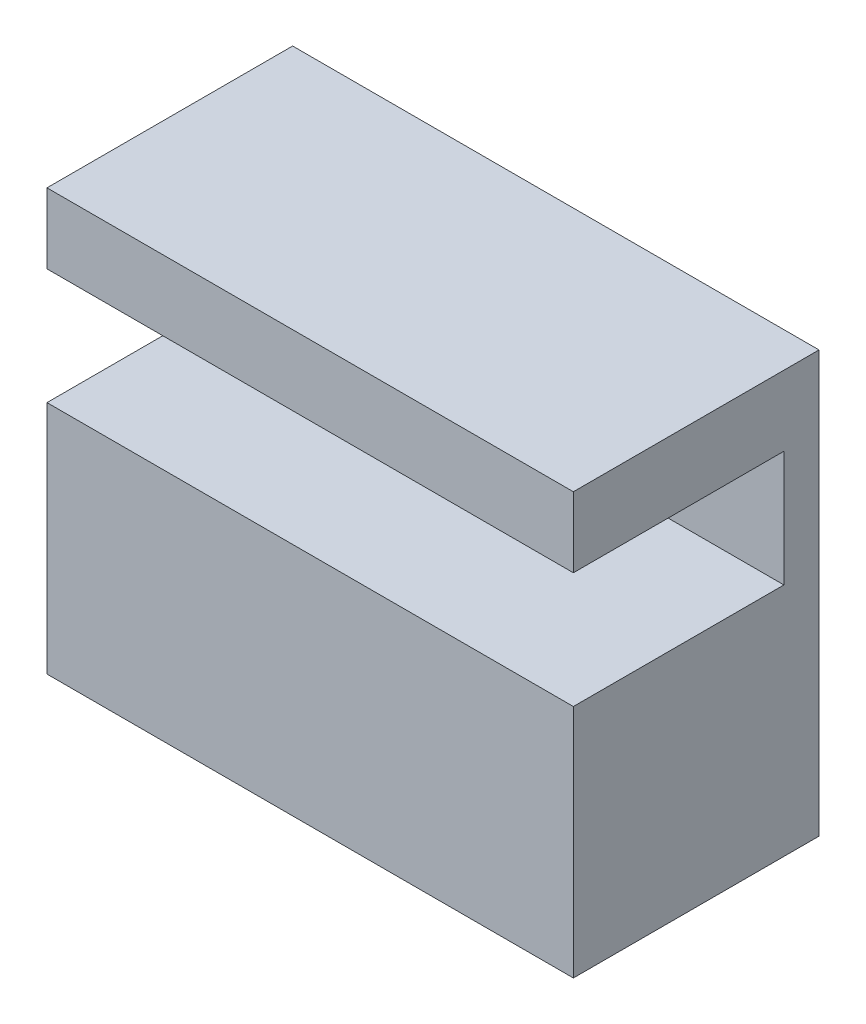
ISO-10303-21;
HEADER;
FILE_DESCRIPTION(('STEP AP214'),'2;1');
FILE_NAME('part.step','',(''),(''),'','','');
FILE_SCHEMA(('AUTOMOTIVE_DESIGN { 1 0 10303 214 1 1 1 1 }'));
ENDSEC;
DATA;
#1=APPLICATION_CONTEXT('core data for automotive mechanical design processes');
#2=APPLICATION_PROTOCOL_DEFINITION('international standard','automotive_design',2000,#1);
#3=PRODUCT_CONTEXT('',#1,'mechanical');
#4=PRODUCT('Part','Part','',(#3));
#5=PRODUCT_RELATED_PRODUCT_CATEGORY('part','',(#4));
#6=PRODUCT_DEFINITION_FORMATION('','',#4);
#7=PRODUCT_DEFINITION_CONTEXT('part definition',#1,'design');
#8=PRODUCT_DEFINITION('design','',#6,#7);
#9=PRODUCT_DEFINITION_SHAPE('','',#8);
#10=(LENGTH_UNIT() NAMED_UNIT(*) SI_UNIT(.MILLI.,.METRE.));
#11=(NAMED_UNIT(*) PLANE_ANGLE_UNIT() SI_UNIT($,.RADIAN.));
#12=(NAMED_UNIT(*) SI_UNIT($,.STERADIAN.) SOLID_ANGLE_UNIT());
#13=UNCERTAINTY_MEASURE_WITH_UNIT(LENGTH_MEASURE(1.E-05),#10,'distance_accuracy_value','');
#14=(GEOMETRIC_REPRESENTATION_CONTEXT(3) GLOBAL_UNCERTAINTY_ASSIGNED_CONTEXT((#13)) GLOBAL_UNIT_ASSIGNED_CONTEXT((#10,
#11,#12)) REPRESENTATION_CONTEXT('',''));
#15=CARTESIAN_POINT('',(0.,0.,0.));
#16=DIRECTION('',(0.,0.,1.));
#17=DIRECTION('',(1.,0.,0.));
#18=AXIS2_PLACEMENT_3D('',#15,#16,#17);
#19=CARTESIAN_POINT('',(7.5,6.,7.));
#20=DIRECTION('',(-1.,0.,0.));
#21=DIRECTION('',(0.,-1.,0.));
#22=AXIS2_PLACEMENT_3D('',#19,#20,#21);
#23=PLANE('',#22);
#24=DIRECTION('',(0.,0.,1.));
#25=VECTOR('',#24,1.);
#26=CARTESIAN_POINT('',(7.5,4.,1.));
#27=LINE('',#26,#25);
#28=CARTESIAN_POINT('',(7.5,4.,1.));
#29=VERTEX_POINT('',#28);
#30=CARTESIAN_POINT('',(7.5,4.,7.));
#31=VERTEX_POINT('',#30);
#32=EDGE_CURVE('E137',#29,#31,#27,.T.);
#33=ORIENTED_EDGE('',*,*,#32,.F.);
#34=DIRECTION('',(0.,1.,0.));
#35=VECTOR('',#34,1.);
#36=CARTESIAN_POINT('',(7.5,0.,1.));
#37=LINE('',#36,#35);
#38=CARTESIAN_POINT('',(7.5,0.699999999999999,1.));
#39=VERTEX_POINT('',#38);
#40=EDGE_CURVE('E117',#39,#29,#37,.T.);
#41=ORIENTED_EDGE('',*,*,#40,.F.);
#42=DIRECTION('',(0.,0.,1.));
#43=VECTOR('',#42,1.);
#44=CARTESIAN_POINT('',(7.5,0.699999999999999,1.));
#45=LINE('',#44,#43);
#46=CARTESIAN_POINT('',(7.5,0.699999999999999,7.));
#47=VERTEX_POINT('',#46);
#48=EDGE_CURVE('E140',#39,#47,#45,.T.);
#49=ORIENTED_EDGE('',*,*,#48,.T.);
#50=DIRECTION('',(0.,1.,0.));
#51=VECTOR('',#50,1.);
#52=CARTESIAN_POINT('',(7.5,6.,7.));
#53=LINE('',#52,#51);
#54=CARTESIAN_POINT('',(7.5,-6.,7.));
#55=VERTEX_POINT('',#54);
#56=EDGE_CURVE('E144',#55,#47,#53,.T.);
#57=ORIENTED_EDGE('',*,*,#56,.F.);
#58=DIRECTION('',(0.,0.,-1.));
#59=VECTOR('',#58,1.);
#60=CARTESIAN_POINT('',(7.5,-6.,7.));
#61=LINE('',#60,#59);
#62=CARTESIAN_POINT('',(7.5,-6.,0.));
#63=VERTEX_POINT('',#62);
#64=EDGE_CURVE('E152',#55,#63,#61,.T.);
#65=ORIENTED_EDGE('',*,*,#64,.T.);
#66=DIRECTION('',(0.,1.,0.));
#67=VECTOR('',#66,1.);
#68=CARTESIAN_POINT('',(7.5,6.,0.));
#69=LINE('',#68,#67);
#70=CARTESIAN_POINT('',(7.5,6.,0.));
#71=VERTEX_POINT('',#70);
#72=EDGE_CURVE('E139',#63,#71,#69,.T.);
#73=ORIENTED_EDGE('',*,*,#72,.T.);
#74=DIRECTION('',(0.,0.,-1.));
#75=VECTOR('',#74,1.);
#76=CARTESIAN_POINT('',(7.5,6.,7.));
#77=LINE('',#76,#75);
#78=CARTESIAN_POINT('',(7.5,6.,7.));
#79=VERTEX_POINT('',#78);
#80=EDGE_CURVE('E11',#79,#71,#77,.T.);
#81=ORIENTED_EDGE('',*,*,#80,.F.);
#82=EDGE_CURVE('E85',#31,#79,#53,.T.);
#83=ORIENTED_EDGE('',*,*,#82,.F.);
#84=EDGE_LOOP('',(#33,#41,#49,#57,#65,#73,#81,#83));
#85=FACE_BOUND('',#84,.T.);
#86=ADVANCED_FACE('F33',(#85),#23,.F.);
#87=CARTESIAN_POINT('',(-7.5,6.,7.));
#88=DIRECTION('',(1.,0.,0.));
#89=DIRECTION('',(0.,1.,0.));
#90=AXIS2_PLACEMENT_3D('',#87,#88,#89);
#91=PLANE('',#90);
#92=DIRECTION('',(0.,0.,1.));
#93=VECTOR('',#92,1.);
#94=CARTESIAN_POINT('',(-7.5,4.,1.));
#95=LINE('',#94,#93);
#96=CARTESIAN_POINT('',(-7.5,4.,1.));
#97=VERTEX_POINT('',#96);
#98=CARTESIAN_POINT('',(-7.5,4.,7.));
#99=VERTEX_POINT('',#98);
#100=EDGE_CURVE('E107',#97,#99,#95,.T.);
#101=ORIENTED_EDGE('',*,*,#100,.T.);
#102=DIRECTION('',(0.,-1.,0.));
#103=VECTOR('',#102,1.);
#104=CARTESIAN_POINT('',(-7.5,6.,7.));
#105=LINE('',#104,#103);
#106=CARTESIAN_POINT('',(-7.5,6.,7.));
#107=VERTEX_POINT('',#106);
#108=EDGE_CURVE('E149',#107,#99,#105,.T.);
#109=ORIENTED_EDGE('',*,*,#108,.F.);
#110=DIRECTION('',(0.,0.,-1.));
#111=VECTOR('',#110,1.);
#112=CARTESIAN_POINT('',(-7.5,6.,7.));
#113=LINE('',#112,#111);
#114=CARTESIAN_POINT('',(-7.5,6.,0.));
#115=VERTEX_POINT('',#114);
#116=EDGE_CURVE('E40',#107,#115,#113,.T.);
#117=ORIENTED_EDGE('',*,*,#116,.T.);
#118=DIRECTION('',(0.,-1.,0.));
#119=VECTOR('',#118,1.);
#120=CARTESIAN_POINT('',(-7.5,6.,0.));
#121=LINE('',#120,#119);
#122=CARTESIAN_POINT('',(-7.5,-6.,0.));
#123=VERTEX_POINT('',#122);
#124=EDGE_CURVE('E157',#115,#123,#121,.T.);
#125=ORIENTED_EDGE('',*,*,#124,.T.);
#126=DIRECTION('',(0.,0.,-1.));
#127=VECTOR('',#126,1.);
#128=CARTESIAN_POINT('',(-7.5,-6.,7.));
#129=LINE('',#128,#127);
#130=CARTESIAN_POINT('',(-7.5,-6.,7.));
#131=VERTEX_POINT('',#130);
#132=EDGE_CURVE('E161',#131,#123,#129,.T.);
#133=ORIENTED_EDGE('',*,*,#132,.F.);
#134=CARTESIAN_POINT('',(-7.5,0.699999999999999,7.));
#135=VERTEX_POINT('',#134);
#136=EDGE_CURVE('E148',#135,#131,#105,.T.);
#137=ORIENTED_EDGE('',*,*,#136,.F.);
#138=DIRECTION('',(0.,0.,1.));
#139=VECTOR('',#138,1.);
#140=CARTESIAN_POINT('',(-7.5,0.699999999999999,1.));
#141=LINE('',#140,#139);
#142=CARTESIAN_POINT('',(-7.5,0.699999999999999,1.));
#143=VERTEX_POINT('',#142);
#144=EDGE_CURVE('E47',#143,#135,#141,.T.);
#145=ORIENTED_EDGE('',*,*,#144,.F.);
#146=DIRECTION('',(0.,-1.,0.));
#147=VECTOR('',#146,1.);
#148=CARTESIAN_POINT('',(-7.5,0.,1.));
#149=LINE('',#148,#147);
#150=EDGE_CURVE('E123',#97,#143,#149,.T.);
#151=ORIENTED_EDGE('',*,*,#150,.F.);
#152=EDGE_LOOP('',(#101,#109,#117,#125,#133,#137,#145,#151));
#153=FACE_BOUND('',#152,.T.);
#154=ADVANCED_FACE('F128',(#153),#91,.F.);
#155=CARTESIAN_POINT('',(0.,0.,7.));
#156=DIRECTION('',(0.,0.,1.));
#157=DIRECTION('',(1.,0.,0.));
#158=AXIS2_PLACEMENT_3D('',#155,#156,#157);
#159=PLANE('',#158);
#160=ORIENTED_EDGE('',*,*,#108,.T.);
#161=DIRECTION('',(1.,0.,0.));
#162=VECTOR('',#161,1.);
#163=CARTESIAN_POINT('',(0.,4.,7.));
#164=LINE('',#163,#162);
#165=EDGE_CURVE('E112',#99,#31,#164,.T.);
#166=ORIENTED_EDGE('',*,*,#165,.T.);
#167=ORIENTED_EDGE('',*,*,#82,.T.);
#168=DIRECTION('',(-1.,0.,0.));
#169=VECTOR('',#168,1.);
#170=CARTESIAN_POINT('',(-7.5,6.,7.));
#171=LINE('',#170,#169);
#172=EDGE_CURVE('E146',#79,#107,#171,.T.);
#173=ORIENTED_EDGE('',*,*,#172,.T.);
#174=EDGE_LOOP('',(#160,#166,#167,#173));
#175=FACE_BOUND('',#174,.T.);
#176=ADVANCED_FACE('F176',(#175),#159,.T.);
#177=CARTESIAN_POINT('',(-7.5,6.,7.));
#178=DIRECTION('',(0.,-1.,0.));
#179=DIRECTION('',(0.,0.,-1.));
#180=AXIS2_PLACEMENT_3D('',#177,#178,#179);
#181=PLANE('',#180);
#182=DIRECTION('',(-1.,0.,0.));
#183=VECTOR('',#182,1.);
#184=CARTESIAN_POINT('',(-7.5,6.,0.));
#185=LINE('',#184,#183);
#186=EDGE_CURVE('E155',#71,#115,#185,.T.);
#187=ORIENTED_EDGE('',*,*,#186,.T.);
#188=ORIENTED_EDGE('',*,*,#116,.F.);
#189=ORIENTED_EDGE('',*,*,#172,.F.);
#190=ORIENTED_EDGE('',*,*,#80,.T.);
#191=EDGE_LOOP('',(#187,#188,#189,#190));
#192=FACE_BOUND('',#191,.T.);
#193=ADVANCED_FACE('F177',(#192),#181,.F.);
#194=CARTESIAN_POINT('',(-7.5,-6.,7.));
#195=DIRECTION('',(0.,1.,0.));
#196=DIRECTION('',(0.,0.,1.));
#197=AXIS2_PLACEMENT_3D('',#194,#195,#196);
#198=PLANE('',#197);
#199=DIRECTION('',(1.,0.,0.));
#200=VECTOR('',#199,1.);
#201=CARTESIAN_POINT('',(-7.5,-6.,0.));
#202=LINE('',#201,#200);
#203=EDGE_CURVE('E77',#123,#63,#202,.T.);
#204=ORIENTED_EDGE('',*,*,#203,.T.);
#205=ORIENTED_EDGE('',*,*,#64,.F.);
#206=DIRECTION('',(1.,0.,0.));
#207=VECTOR('',#206,1.);
#208=CARTESIAN_POINT('',(-7.5,-6.,7.));
#209=LINE('',#208,#207);
#210=EDGE_CURVE('E56',#131,#55,#209,.T.);
#211=ORIENTED_EDGE('',*,*,#210,.F.);
#212=ORIENTED_EDGE('',*,*,#132,.T.);
#213=EDGE_LOOP('',(#204,#205,#211,#212));
#214=FACE_BOUND('',#213,.T.);
#215=ADVANCED_FACE('F173',(#214),#198,.F.);
#216=DIRECTION('',(1.,0.,0.));
#217=VECTOR('',#216,1.);
#218=CARTESIAN_POINT('',(0.,0.699999999999999,7.));
#219=LINE('',#218,#217);
#220=EDGE_CURVE('E126',#135,#47,#219,.T.);
#221=ORIENTED_EDGE('',*,*,#220,.F.);
#222=ORIENTED_EDGE('',*,*,#136,.T.);
#223=ORIENTED_EDGE('',*,*,#210,.T.);
#224=ORIENTED_EDGE('',*,*,#56,.T.);
#225=EDGE_LOOP('',(#221,#222,#223,#224));
#226=FACE_BOUND('',#225,.T.);
#227=ADVANCED_FACE('F174',(#226),#159,.T.);
#228=CARTESIAN_POINT('',(0.,0.,0.));
#229=DIRECTION('',(0.,0.,1.));
#230=DIRECTION('',(1.,0.,0.));
#231=AXIS2_PLACEMENT_3D('',#228,#229,#230);
#232=PLANE('',#231);
#233=ORIENTED_EDGE('',*,*,#72,.F.);
#234=ORIENTED_EDGE('',*,*,#203,.F.);
#235=ORIENTED_EDGE('',*,*,#124,.F.);
#236=ORIENTED_EDGE('',*,*,#186,.F.);
#237=EDGE_LOOP('',(#233,#234,#235,#236));
#238=FACE_BOUND('',#237,.T.);
#239=ADVANCED_FACE('F169',(#238),#232,.F.);
#240=CARTESIAN_POINT('',(0.,4.,1.));
#241=DIRECTION('',(0.,-1.,0.));
#242=DIRECTION('',(0.,0.,-1.));
#243=AXIS2_PLACEMENT_3D('',#240,#241,#242);
#244=PLANE('',#243);
#245=ORIENTED_EDGE('',*,*,#165,.F.);
#246=ORIENTED_EDGE('',*,*,#100,.F.);
#247=DIRECTION('',(1.,0.,0.));
#248=VECTOR('',#247,1.);
#249=CARTESIAN_POINT('',(0.,4.,1.));
#250=LINE('',#249,#248);
#251=EDGE_CURVE('E110',#97,#29,#250,.T.);
#252=ORIENTED_EDGE('',*,*,#251,.T.);
#253=ORIENTED_EDGE('',*,*,#32,.T.);
#254=EDGE_LOOP('',(#245,#246,#252,#253));
#255=FACE_BOUND('',#254,.T.);
#256=ADVANCED_FACE('F109',(#255),#244,.T.);
#257=CARTESIAN_POINT('',(0.,0.699999999999999,1.));
#258=DIRECTION('',(0.,-1.,0.));
#259=DIRECTION('',(0.,0.,-1.));
#260=AXIS2_PLACEMENT_3D('',#257,#258,#259);
#261=PLANE('',#260);
#262=ORIENTED_EDGE('',*,*,#220,.T.);
#263=ORIENTED_EDGE('',*,*,#48,.F.);
#264=DIRECTION('',(1.,0.,0.));
#265=VECTOR('',#264,1.);
#266=CARTESIAN_POINT('',(0.,0.699999999999999,1.));
#267=LINE('',#266,#265);
#268=EDGE_CURVE('E130',#143,#39,#267,.T.);
#269=ORIENTED_EDGE('',*,*,#268,.F.);
#270=ORIENTED_EDGE('',*,*,#144,.T.);
#271=EDGE_LOOP('',(#262,#263,#269,#270));
#272=FACE_BOUND('',#271,.T.);
#273=ADVANCED_FACE('F175',(#272),#261,.F.);
#274=CARTESIAN_POINT('',(0.,0.,1.));
#275=DIRECTION('',(0.,0.,1.));
#276=DIRECTION('',(1.,0.,0.));
#277=AXIS2_PLACEMENT_3D('',#274,#275,#276);
#278=PLANE('',#277);
#279=ORIENTED_EDGE('',*,*,#251,.F.);
#280=ORIENTED_EDGE('',*,*,#150,.T.);
#281=ORIENTED_EDGE('',*,*,#268,.T.);
#282=ORIENTED_EDGE('',*,*,#40,.T.);
#283=EDGE_LOOP('',(#279,#280,#281,#282));
#284=FACE_BOUND('',#283,.T.);
#285=ADVANCED_FACE('F121',(#284),#278,.T.);
#286=CLOSED_SHELL('',(#86,#154,#176,#193,#215,#227,#239,#256,#273,#285));
#287=MANIFOLD_SOLID_BREP('B2',#286);
#288=ADVANCED_BREP_SHAPE_REPRESENTATION('',(#18,#287),#14);
#289=SHAPE_DEFINITION_REPRESENTATION(#9,#288);
ENDSEC;
END-ISO-10303-21;
